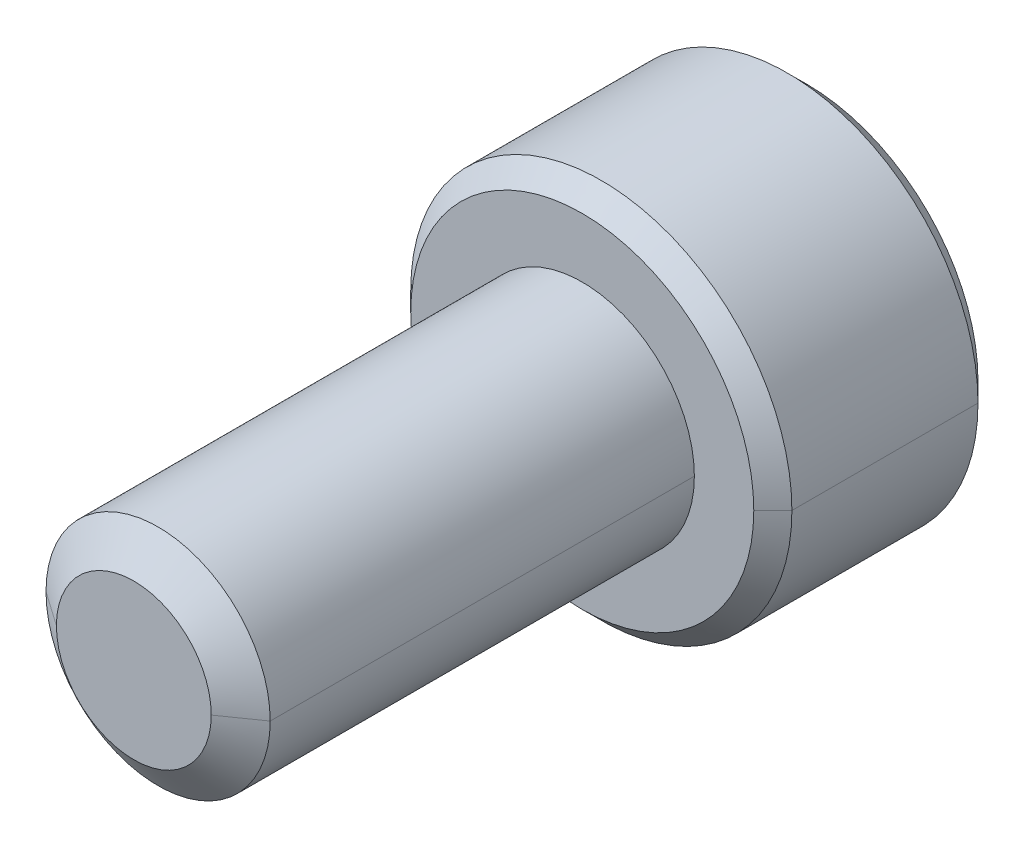
ISO-10303-21;
HEADER;
FILE_DESCRIPTION(('STEP AP214'),'2;1');
FILE_NAME('part.step','',(''),(''),'','','');
FILE_SCHEMA(('AUTOMOTIVE_DESIGN { 1 0 10303 214 1 1 1 1 }'));
ENDSEC;
DATA;
#1=APPLICATION_CONTEXT('core data for automotive mechanical design processes');
#2=APPLICATION_PROTOCOL_DEFINITION('international standard','automotive_design',2000,#1);
#3=PRODUCT_CONTEXT('',#1,'mechanical');
#4=PRODUCT('Part','Part','',(#3));
#5=PRODUCT_RELATED_PRODUCT_CATEGORY('part','',(#4));
#6=PRODUCT_DEFINITION_FORMATION('','',#4);
#7=PRODUCT_DEFINITION_CONTEXT('part definition',#1,'design');
#8=PRODUCT_DEFINITION('design','',#6,#7);
#9=PRODUCT_DEFINITION_SHAPE('','',#8);
#10=(LENGTH_UNIT() NAMED_UNIT(*) SI_UNIT(.MILLI.,.METRE.));
#11=(NAMED_UNIT(*) PLANE_ANGLE_UNIT() SI_UNIT($,.RADIAN.));
#12=(NAMED_UNIT(*) SI_UNIT($,.STERADIAN.) SOLID_ANGLE_UNIT());
#13=UNCERTAINTY_MEASURE_WITH_UNIT(LENGTH_MEASURE(1.E-05),#10,'distance_accuracy_value','');
#14=(GEOMETRIC_REPRESENTATION_CONTEXT(3) GLOBAL_UNCERTAINTY_ASSIGNED_CONTEXT((#13)) GLOBAL_UNIT_ASSIGNED_CONTEXT((#10,
#11,#12)) REPRESENTATION_CONTEXT('',''));
#15=CARTESIAN_POINT('',(0.,0.,0.));
#16=DIRECTION('',(0.,0.,1.));
#17=DIRECTION('',(1.,0.,0.));
#18=AXIS2_PLACEMENT_3D('',#15,#16,#17);
#19=CARTESIAN_POINT('',(0.,0.,-10.425));
#20=DIRECTION('',(0.,0.,-1.));
#21=DIRECTION('',(-1.,0.,0.));
#22=AXIS2_PLACEMENT_3D('',#19,#20,#21);
#23=CONICAL_SURFACE('',#22,4.25,0.785398163397452);
#24=CARTESIAN_POINT('',(0.,0.,-10.));
#25=DIRECTION('',(0.,0.,1.));
#26=DIRECTION('',(-1.,0.,0.));
#27=AXIS2_PLACEMENT_3D('',#24,#25,#26);
#28=CIRCLE('',#27,3.825);
#29=CARTESIAN_POINT('',(3.825,0.,-10.));
#30=VERTEX_POINT('',#29);
#31=CARTESIAN_POINT('',(-3.825,0.,-10.));
#32=VERTEX_POINT('',#31);
#33=EDGE_CURVE('E44',#30,#32,#28,.T.);
#34=ORIENTED_EDGE('',*,*,#33,.F.);
#35=DIRECTION('',(0.707106781186551,0.,-0.707106781186545));
#36=VECTOR('',#35,1.);
#37=CARTESIAN_POINT('',(4.25,0.,-10.425));
#38=LINE('',#37,#36);
#39=CARTESIAN_POINT('',(4.25,0.,-10.425));
#40=VERTEX_POINT('',#39);
#41=EDGE_CURVE('E11',#30,#40,#38,.T.);
#42=ORIENTED_EDGE('',*,*,#41,.T.);
#43=CARTESIAN_POINT('',(0.,0.,-10.425));
#44=DIRECTION('',(0.,0.,-1.));
#45=DIRECTION('',(-1.,0.,0.));
#46=AXIS2_PLACEMENT_3D('',#43,#44,#45);
#47=CIRCLE('',#46,4.25);
#48=CARTESIAN_POINT('',(-4.25,0.,-10.425));
#49=VERTEX_POINT('',#48);
#50=EDGE_CURVE('E877',#49,#40,#47,.T.);
#51=ORIENTED_EDGE('',*,*,#50,.F.);
#52=DIRECTION('',(-0.707106781186551,0.,-0.707106781186545));
#53=VECTOR('',#52,1.);
#54=CARTESIAN_POINT('',(-4.25,0.,-10.425));
#55=LINE('',#54,#53);
#56=EDGE_CURVE('E99',#32,#49,#55,.T.);
#57=ORIENTED_EDGE('',*,*,#56,.F.);
#58=EDGE_LOOP('',(#34,#42,#51,#57));
#59=FACE_BOUND('',#58,.T.);
#60=ADVANCED_FACE('F16',(#59),#23,.T.);
#61=CARTESIAN_POINT('',(0.,0.,-15.));
#62=DIRECTION('',(0.,0.,1.));
#63=DIRECTION('',(1.,0.,0.));
#64=AXIS2_PLACEMENT_3D('',#61,#62,#63);
#65=CONICAL_SURFACE('',#64,3.825,0.785398163397442);
#66=CARTESIAN_POINT('',(0.,0.,-15.));
#67=DIRECTION('',(0.,0.,-1.));
#68=DIRECTION('',(-1.,0.,0.));
#69=AXIS2_PLACEMENT_3D('',#66,#67,#68);
#70=CIRCLE('',#69,3.825);
#71=CARTESIAN_POINT('',(-3.825,0.,-15.));
#72=VERTEX_POINT('',#71);
#73=CARTESIAN_POINT('',(3.825,0.,-15.));
#74=VERTEX_POINT('',#73);
#75=EDGE_CURVE('E858',#72,#74,#70,.T.);
#76=ORIENTED_EDGE('',*,*,#75,.F.);
#77=DIRECTION('',(-0.707106781186543,0.,0.707106781186552));
#78=VECTOR('',#77,1.);
#79=CARTESIAN_POINT('',(-3.825,0.,-15.));
#80=LINE('',#79,#78);
#81=CARTESIAN_POINT('',(-4.25,0.,-14.575));
#82=VERTEX_POINT('',#81);
#83=EDGE_CURVE('E30',#72,#82,#80,.T.);
#84=ORIENTED_EDGE('',*,*,#83,.T.);
#85=CARTESIAN_POINT('',(0.,0.,-14.575));
#86=DIRECTION('',(0.,0.,1.));
#87=DIRECTION('',(-1.,0.,0.));
#88=AXIS2_PLACEMENT_3D('',#85,#86,#87);
#89=CIRCLE('',#88,4.25);
#90=CARTESIAN_POINT('',(4.25,0.,-14.575));
#91=VERTEX_POINT('',#90);
#92=EDGE_CURVE('E417',#91,#82,#89,.T.);
#93=ORIENTED_EDGE('',*,*,#92,.F.);
#94=DIRECTION('',(0.707106781186543,0.,0.707106781186552));
#95=VECTOR('',#94,1.);
#96=CARTESIAN_POINT('',(3.825,0.,-15.));
#97=LINE('',#96,#95);
#98=EDGE_CURVE('E407',#74,#91,#97,.T.);
#99=ORIENTED_EDGE('',*,*,#98,.F.);
#100=EDGE_LOOP('',(#76,#84,#93,#99));
#101=FACE_BOUND('',#100,.T.);
#102=ADVANCED_FACE('F262',(#101),#65,.T.);
#103=CARTESIAN_POINT('',(0.,0.,-15.));
#104=DIRECTION('',(0.,0.,-1.));
#105=DIRECTION('',(-1.,0.,0.));
#106=AXIS2_PLACEMENT_3D('',#103,#104,#105);
#107=CONICAL_SURFACE('',#106,2.30940107675851,0.78539816339745);
#108=CARTESIAN_POINT('',(-2.,0.,-14.6905989232415));
#109=CARTESIAN_POINT('',(-2.,0.290764194433292,-14.6905989232415));
#110=CARTESIAN_POINT('',(-2.,0.594613289971653,-14.7771187445255));
#111=CARTESIAN_POINT('',(-2.,0.860171071046533,-14.8527352663336));
#112=CARTESIAN_POINT('',(-2.,1.15470053837925,-15.));
#113=B_SPLINE_CURVE_WITH_KNOTS('',2,(#108,#109,#110,#111,#112),.UNSPECIFIED.,.F.,.F.,(3,2,3),
(0.,0.5,1.),.UNSPECIFIED.);
#114=CARTESIAN_POINT('',(-2.,0.,-14.6905989232415));
#115=VERTEX_POINT('',#114);
#116=CARTESIAN_POINT('',(-2.,1.15470053837925,-15.));
#117=VERTEX_POINT('',#116);
#118=EDGE_CURVE('E174',#115,#117,#113,.T.);
#119=ORIENTED_EDGE('',*,*,#118,.F.);
#120=DIRECTION('',(-0.707106781186549,0.,-0.707106781186546));
#121=VECTOR('',#120,1.);
#122=CARTESIAN_POINT('',(-2.30940107675851,0.,-15.));
#123=LINE('',#122,#121);
#124=CARTESIAN_POINT('',(-2.30940107675851,0.,-15.));
#125=VERTEX_POINT('',#124);
#126=EDGE_CURVE('E167',#115,#125,#123,.T.);
#127=ORIENTED_EDGE('',*,*,#126,.T.);
#128=CARTESIAN_POINT('',(0.,0.,-15.));
#129=DIRECTION('',(0.,0.,-1.));
#130=DIRECTION('',(-1.,0.,0.));
#131=AXIS2_PLACEMENT_3D('',#128,#129,#130);
#132=CIRCLE('',#131,2.30940107675851);
#133=EDGE_CURVE('E194',#125,#117,#132,.T.);
#134=ORIENTED_EDGE('',*,*,#133,.T.);
#135=EDGE_LOOP('',(#119,#127,#134));
#136=FACE_BOUND('',#135,.T.);
#137=ADVANCED_FACE('F253',(#136),#107,.F.);
#138=CARTESIAN_POINT('',(0.,0.,-15.));
#139=DIRECTION('',(0.,0.,1.));
#140=DIRECTION('',(1.,0.,0.));
#141=AXIS2_PLACEMENT_3D('',#138,#139,#140);
#142=CYLINDRICAL_SURFACE('',#141,4.25);
#143=ORIENTED_EDGE('',*,*,#92,.T.);
#144=DIRECTION('',(0.,0.,1.));
#145=VECTOR('',#144,1.);
#146=CARTESIAN_POINT('',(-4.25,0.,-15.));
#147=LINE('',#146,#145);
#148=EDGE_CURVE('E873',#82,#49,#147,.T.);
#149=ORIENTED_EDGE('',*,*,#148,.T.);
#150=ORIENTED_EDGE('',*,*,#50,.T.);
#151=DIRECTION('',(0.,0.,1.));
#152=VECTOR('',#151,1.);
#153=CARTESIAN_POINT('',(4.25,0.,-15.));
#154=LINE('',#153,#152);
#155=EDGE_CURVE('E850',#91,#40,#154,.T.);
#156=ORIENTED_EDGE('',*,*,#155,.F.);
#157=EDGE_LOOP('',(#143,#149,#150,#156));
#158=FACE_BOUND('',#157,.T.);
#159=ADVANCED_FACE('F261',(#158),#142,.T.);
#160=CARTESIAN_POINT('',(0.,0.,0.));
#161=DIRECTION('',(0.,0.,-1.));
#162=DIRECTION('',(-1.,0.,0.));
#163=AXIS2_PLACEMENT_3D('',#160,#161,#162);
#164=CONICAL_SURFACE('',#163,1.72638475772934,0.959931088596884);
#165=CARTESIAN_POINT('',(0.,0.,0.));
#166=DIRECTION('',(0.,0.,1.));
#167=DIRECTION('',(1.,0.,0.));
#168=AXIS2_PLACEMENT_3D('',#165,#166,#167);
#169=CIRCLE('',#168,1.72638475772934);
#170=CARTESIAN_POINT('',(1.72638475772934,0.,0.));
#171=VERTEX_POINT('',#170);
#172=CARTESIAN_POINT('',(-1.72638475772934,0.,0.));
#173=VERTEX_POINT('',#172);
#174=EDGE_CURVE('E842',#171,#173,#169,.T.);
#175=ORIENTED_EDGE('',*,*,#174,.F.);
#176=DIRECTION('',(0.819152044288993,0.,-0.573576436351044));
#177=VECTOR('',#176,1.);
#178=CARTESIAN_POINT('',(1.72638475772934,0.,0.));
#179=LINE('',#178,#177);
#180=CARTESIAN_POINT('',(2.5,0.,-0.541691224311848));
#181=VERTEX_POINT('',#180);
#182=EDGE_CURVE('E891',#171,#181,#179,.T.);
#183=ORIENTED_EDGE('',*,*,#182,.T.);
#184=CARTESIAN_POINT('',(0.,0.,-0.541691224311848));
#185=DIRECTION('',(0.,0.,1.));
#186=DIRECTION('',(1.,0.,0.));
#187=AXIS2_PLACEMENT_3D('',#184,#185,#186);
#188=CIRCLE('',#187,2.5);
#189=CARTESIAN_POINT('',(-2.5,0.,-0.541691224311848));
#190=VERTEX_POINT('',#189);
#191=EDGE_CURVE('E894',#181,#190,#188,.T.);
#192=ORIENTED_EDGE('',*,*,#191,.T.);
#193=DIRECTION('',(-0.819152044288993,0.,-0.573576436351044));
#194=VECTOR('',#193,1.);
#195=CARTESIAN_POINT('',(-1.72638475772934,0.,0.));
#196=LINE('',#195,#194);
#197=EDGE_CURVE('E864',#173,#190,#196,.T.);
#198=ORIENTED_EDGE('',*,*,#197,.F.);
#199=EDGE_LOOP('',(#175,#183,#192,#198));
#200=FACE_BOUND('',#199,.T.);
#201=ADVANCED_FACE('F229',(#200),#164,.T.);
#202=CARTESIAN_POINT('',(0.,0.,-10.));
#203=DIRECTION('',(0.,0.,1.));
#204=DIRECTION('',(1.,0.,0.));
#205=AXIS2_PLACEMENT_3D('',#202,#203,#204);
#206=CYLINDRICAL_SURFACE('',#205,2.5);
#207=CARTESIAN_POINT('',(0.,0.,-10.));
#208=DIRECTION('',(0.,0.,1.));
#209=DIRECTION('',(-1.,0.,0.));
#210=AXIS2_PLACEMENT_3D('',#207,#208,#209);
#211=CIRCLE('',#210,2.5);
#212=CARTESIAN_POINT('',(2.5,0.,-10.));
#213=VERTEX_POINT('',#212);
#214=CARTESIAN_POINT('',(-2.5,0.,-10.));
#215=VERTEX_POINT('',#214);
#216=EDGE_CURVE('E846',#213,#215,#211,.T.);
#217=ORIENTED_EDGE('',*,*,#216,.T.);
#218=DIRECTION('',(0.,0.,1.));
#219=VECTOR('',#218,1.);
#220=CARTESIAN_POINT('',(-2.5,0.,-10.));
#221=LINE('',#220,#219);
#222=EDGE_CURVE('E843',#215,#190,#221,.T.);
#223=ORIENTED_EDGE('',*,*,#222,.T.);
#224=ORIENTED_EDGE('',*,*,#191,.F.);
#225=DIRECTION('',(0.,0.,1.));
#226=VECTOR('',#225,1.);
#227=CARTESIAN_POINT('',(2.5,0.,-10.));
#228=LINE('',#227,#226);
#229=EDGE_CURVE('E866',#213,#181,#228,.T.);
#230=ORIENTED_EDGE('',*,*,#229,.F.);
#231=EDGE_LOOP('',(#217,#223,#224,#230));
#232=FACE_BOUND('',#231,.T.);
#233=ADVANCED_FACE('F290',(#232),#206,.T.);
#234=CARTESIAN_POINT('',(0.,0.,-10.));
#235=DIRECTION('',(0.,0.,1.));
#236=DIRECTION('',(1.,0.,0.));
#237=AXIS2_PLACEMENT_3D('',#234,#235,#236);
#238=CYLINDRICAL_SURFACE('',#237,2.5);
#239=ORIENTED_EDGE('',*,*,#222,.F.);
#240=CARTESIAN_POINT('',(0.,0.,-10.));
#241=DIRECTION('',(0.,0.,1.));
#242=DIRECTION('',(-1.,0.,0.));
#243=AXIS2_PLACEMENT_3D('',#240,#241,#242);
#244=CIRCLE('',#243,2.5);
#245=EDGE_CURVE('E847',#215,#213,#244,.T.);
#246=ORIENTED_EDGE('',*,*,#245,.T.);
#247=ORIENTED_EDGE('',*,*,#229,.T.);
#248=CARTESIAN_POINT('',(0.,0.,-0.541691224311848));
#249=DIRECTION('',(0.,0.,1.));
#250=DIRECTION('',(1.,0.,0.));
#251=AXIS2_PLACEMENT_3D('',#248,#249,#250);
#252=CIRCLE('',#251,2.5);
#253=EDGE_CURVE('E841',#190,#181,#252,.T.);
#254=ORIENTED_EDGE('',*,*,#253,.F.);
#255=EDGE_LOOP('',(#239,#246,#247,#254));
#256=FACE_BOUND('',#255,.T.);
#257=ADVANCED_FACE('F293',(#256),#238,.T.);
#258=CARTESIAN_POINT('',(0.,0.,0.));
#259=DIRECTION('',(0.,0.,-1.));
#260=DIRECTION('',(-1.,0.,0.));
#261=AXIS2_PLACEMENT_3D('',#258,#259,#260);
#262=CONICAL_SURFACE('',#261,1.72638475772934,0.959931088596884);
#263=ORIENTED_EDGE('',*,*,#182,.F.);
#264=CARTESIAN_POINT('',(0.,0.,0.));
#265=DIRECTION('',(0.,0.,1.));
#266=DIRECTION('',(1.,0.,0.));
#267=AXIS2_PLACEMENT_3D('',#264,#265,#266);
#268=CIRCLE('',#267,1.72638475772934);
#269=EDGE_CURVE('E838',#173,#171,#268,.T.);
#270=ORIENTED_EDGE('',*,*,#269,.F.);
#271=ORIENTED_EDGE('',*,*,#197,.T.);
#272=ORIENTED_EDGE('',*,*,#253,.T.);
#273=EDGE_LOOP('',(#263,#270,#271,#272));
#274=FACE_BOUND('',#273,.T.);
#275=ADVANCED_FACE('F495',(#274),#262,.T.);
#276=CARTESIAN_POINT('',(0.,0.,0.));
#277=DIRECTION('',(0.,0.,1.));
#278=DIRECTION('',(1.,0.,0.));
#279=AXIS2_PLACEMENT_3D('',#276,#277,#278);
#280=PLANE('',#279);
#281=ORIENTED_EDGE('',*,*,#269,.T.);
#282=ORIENTED_EDGE('',*,*,#174,.T.);
#283=EDGE_LOOP('',(#281,#282));
#284=FACE_BOUND('',#283,.T.);
#285=ADVANCED_FACE('F276',(#284),#280,.T.);
#286=CARTESIAN_POINT('',(0.,0.,-15.));
#287=DIRECTION('',(0.,0.,1.));
#288=DIRECTION('',(1.,0.,0.));
#289=AXIS2_PLACEMENT_3D('',#286,#287,#288);
#290=CYLINDRICAL_SURFACE('',#289,4.25);
#291=ORIENTED_EDGE('',*,*,#148,.F.);
#292=CARTESIAN_POINT('',(0.,0.,-14.575));
#293=DIRECTION('',(0.,0.,1.));
#294=DIRECTION('',(-1.,0.,0.));
#295=AXIS2_PLACEMENT_3D('',#292,#293,#294);
#296=CIRCLE('',#295,4.25);
#297=EDGE_CURVE('E855',#82,#91,#296,.T.);
#298=ORIENTED_EDGE('',*,*,#297,.T.);
#299=ORIENTED_EDGE('',*,*,#155,.T.);
#300=CARTESIAN_POINT('',(0.,0.,-10.425));
#301=DIRECTION('',(0.,0.,-1.));
#302=DIRECTION('',(-1.,0.,0.));
#303=AXIS2_PLACEMENT_3D('',#300,#301,#302);
#304=CIRCLE('',#303,4.25);
#305=EDGE_CURVE('E848',#40,#49,#304,.T.);
#306=ORIENTED_EDGE('',*,*,#305,.T.);
#307=EDGE_LOOP('',(#291,#298,#299,#306));
#308=FACE_BOUND('',#307,.T.);
#309=ADVANCED_FACE('F267',(#308),#290,.T.);
#310=CARTESIAN_POINT('',(0.,0.,-15.));
#311=DIRECTION('',(0.,0.,-1.));
#312=DIRECTION('',(0.,-1.,0.));
#313=AXIS2_PLACEMENT_3D('',#310,#311,#312);
#314=PLANE('',#313);
#315=CARTESIAN_POINT('',(0.,0.,-15.));
#316=DIRECTION('',(0.,0.,-1.));
#317=DIRECTION('',(-1.,0.,0.));
#318=AXIS2_PLACEMENT_3D('',#315,#316,#317);
#319=CIRCLE('',#318,3.825);
#320=EDGE_CURVE('E851',#74,#72,#319,.T.);
#321=ORIENTED_EDGE('',*,*,#320,.T.);
#322=ORIENTED_EDGE('',*,*,#75,.T.);
#323=EDGE_LOOP('',(#321,#322));
#324=FACE_BOUND('',#323,.T.);
#325=CARTESIAN_POINT('',(0.,0.,-15.));
#326=DIRECTION('',(0.,0.,-1.));
#327=DIRECTION('',(-1.,0.,0.));
#328=AXIS2_PLACEMENT_3D('',#325,#326,#327);
#329=CIRCLE('',#328,2.30940107675851);
#330=CARTESIAN_POINT('',(0.,2.30940107675851,-15.));
#331=VERTEX_POINT('',#330);
#332=EDGE_CURVE('E196',#117,#331,#329,.T.);
#333=ORIENTED_EDGE('',*,*,#332,.F.);
#334=ORIENTED_EDGE('',*,*,#133,.F.);
#335=CARTESIAN_POINT('',(0.,0.,-15.));
#336=DIRECTION('',(0.,0.,-1.));
#337=DIRECTION('',(-1.,0.,0.));
#338=AXIS2_PLACEMENT_3D('',#335,#336,#337);
#339=CIRCLE('',#338,2.30940107675851);
#340=CARTESIAN_POINT('',(-2.,-1.15470053837925,-15.));
#341=VERTEX_POINT('',#340);
#342=EDGE_CURVE('E165',#341,#125,#339,.T.);
#343=ORIENTED_EDGE('',*,*,#342,.F.);
#344=CARTESIAN_POINT('',(0.,0.,-15.));
#345=DIRECTION('',(0.,0.,-1.));
#346=DIRECTION('',(-1.,0.,0.));
#347=AXIS2_PLACEMENT_3D('',#344,#345,#346);
#348=CIRCLE('',#347,2.30940107675851);
#349=CARTESIAN_POINT('',(0.,-2.30940107675851,-15.));
#350=VERTEX_POINT('',#349);
#351=EDGE_CURVE('E191',#350,#341,#348,.T.);
#352=ORIENTED_EDGE('',*,*,#351,.F.);
#353=CARTESIAN_POINT('',(0.,0.,-15.));
#354=DIRECTION('',(0.,0.,-1.));
#355=DIRECTION('',(-1.,0.,0.));
#356=AXIS2_PLACEMENT_3D('',#353,#354,#355);
#357=CIRCLE('',#356,2.30940107675851);
#358=CARTESIAN_POINT('',(2.,-1.15470053837925,-15.));
#359=VERTEX_POINT('',#358);
#360=EDGE_CURVE('E200',#359,#350,#357,.T.);
#361=ORIENTED_EDGE('',*,*,#360,.F.);
#362=CARTESIAN_POINT('',(0.,0.,-15.));
#363=DIRECTION('',(0.,0.,-1.));
#364=DIRECTION('',(-1.,0.,0.));
#365=AXIS2_PLACEMENT_3D('',#362,#363,#364);
#366=CIRCLE('',#365,2.30940107675851);
#367=CARTESIAN_POINT('',(2.,1.15470053837925,-15.));
#368=VERTEX_POINT('',#367);
#369=EDGE_CURVE('E923',#368,#359,#366,.T.);
#370=ORIENTED_EDGE('',*,*,#369,.F.);
#371=CARTESIAN_POINT('',(0.,0.,-15.));
#372=DIRECTION('',(0.,0.,-1.));
#373=DIRECTION('',(-1.,0.,0.));
#374=AXIS2_PLACEMENT_3D('',#371,#372,#373);
#375=CIRCLE('',#374,2.30940107675851);
#376=EDGE_CURVE('E411',#331,#368,#375,.T.);
#377=ORIENTED_EDGE('',*,*,#376,.F.);
#378=EDGE_LOOP('',(#333,#334,#343,#352,#361,#370,#377));
#379=FACE_BOUND('',#378,.T.);
#380=ADVANCED_FACE('F189',(#324,#379),#314,.T.);
#381=CARTESIAN_POINT('',(0.,0.,-10.));
#382=DIRECTION('',(0.,0.,-1.));
#383=DIRECTION('',(0.,-1.,0.));
#384=AXIS2_PLACEMENT_3D('',#381,#382,#383);
#385=PLANE('',#384);
#386=CARTESIAN_POINT('',(0.,0.,-10.));
#387=DIRECTION('',(0.,0.,1.));
#388=DIRECTION('',(-1.,0.,0.));
#389=AXIS2_PLACEMENT_3D('',#386,#387,#388);
#390=CIRCLE('',#389,3.825);
#391=EDGE_CURVE('E863',#32,#30,#390,.T.);
#392=ORIENTED_EDGE('',*,*,#391,.T.);
#393=ORIENTED_EDGE('',*,*,#33,.T.);
#394=EDGE_LOOP('',(#392,#393));
#395=FACE_BOUND('',#394,.T.);
#396=ORIENTED_EDGE('',*,*,#216,.F.);
#397=ORIENTED_EDGE('',*,*,#245,.F.);
#398=EDGE_LOOP('',(#396,#397));
#399=FACE_BOUND('',#398,.T.);
#400=ADVANCED_FACE('F266',(#395,#399),#385,.F.);
#401=CARTESIAN_POINT('',(0.,0.,-15.));
#402=DIRECTION('',(0.,0.,-1.));
#403=DIRECTION('',(-1.,0.,0.));
#404=AXIS2_PLACEMENT_3D('',#401,#402,#403);
#405=CONICAL_SURFACE('',#404,2.30940107675851,0.78539816339745);
#406=ORIENTED_EDGE('',*,*,#376,.T.);
#407=CARTESIAN_POINT('',(0.,2.30940107675851,-15.));
#408=CARTESIAN_POINT('',(0.252681558768904,2.16351531078402,-14.8541142340255));
#409=CARTESIAN_POINT('',(0.481557611863588,2.03137365991875,-14.7782714741353));
#410=CARTESIAN_POINT('',(0.744004310414816,1.87984998786227,-14.6913043944733));
#411=CARTESIAN_POINT('',(0.996316959809437,1.73417721181434,-14.6906034448313));
#412=CARTESIAN_POINT('',(1.24817855175002,1.58876485390891,-14.6899037482718));
#413=CARTESIAN_POINT('',(1.51174853644651,1.43659265229409,-14.7760681956293));
#414=CARTESIAN_POINT('',(1.74318494981327,1.30297277673651,-14.851727761642));
#415=CARTESIAN_POINT('',(2.,1.15470053837926,-15.));
#416=B_SPLINE_CURVE_WITH_KNOTS('',2,(#407,#408,#409,#410,#411,#412,#413,#414,#415),
.UNSPECIFIED.,.F.,.F.,(3,2,2,2,3),(0.,0.25,0.5,0.75,1.),.UNSPECIFIED.);
#417=EDGE_CURVE('E783',#331,#368,#416,.T.);
#418=ORIENTED_EDGE('',*,*,#417,.F.);
#419=EDGE_LOOP('',(#406,#418));
#420=FACE_BOUND('',#419,.T.);
#421=ADVANCED_FACE('F231',(#420),#405,.F.);
#422=CARTESIAN_POINT('',(0.,0.,-15.));
#423=DIRECTION('',(0.,0.,-1.));
#424=DIRECTION('',(-1.,0.,0.));
#425=AXIS2_PLACEMENT_3D('',#422,#423,#424);
#426=CONICAL_SURFACE('',#425,2.30940107675851,0.78539816339745);
#427=ORIENTED_EDGE('',*,*,#369,.T.);
#428=CARTESIAN_POINT('',(2.,1.15470053837925,-15.));
#429=CARTESIAN_POINT('',(2.,0.860776317135769,-14.8530378893783));
#430=CARTESIAN_POINT('',(2.,0.594673185465975,-14.7771358142435));
#431=CARTESIAN_POINT('',(2.,0.291633315756037,-14.6906980680388));
#432=CARTESIAN_POINT('',(2.,0.000125895055206075,-14.6905989272039));
#433=CARTESIAN_POINT('',(2.,-0.29032906321194,-14.6905001443085));
#434=CARTESIAN_POINT('',(2.,-0.594425580363408,-14.7770652590807));
#435=CARTESIAN_POINT('',(2.,-0.860068804160053,-14.8526841328904));
#436=CARTESIAN_POINT('',(2.,-1.15470053837925,-15.));
#437=B_SPLINE_CURVE_WITH_KNOTS('',2,(#428,#429,#430,#431,#432,#433,#434,#435,#436),
.UNSPECIFIED.,.F.,.F.,(3,2,2,2,3),(0.,0.25,0.5,0.75,1.),.UNSPECIFIED.);
#438=EDGE_CURVE('E330',#368,#359,#437,.T.);
#439=ORIENTED_EDGE('',*,*,#438,.F.);
#440=EDGE_LOOP('',(#427,#439));
#441=FACE_BOUND('',#440,.T.);
#442=ADVANCED_FACE('F298',(#441),#426,.F.);
#443=CARTESIAN_POINT('',(0.,0.,-15.));
#444=DIRECTION('',(0.,0.,-1.));
#445=DIRECTION('',(-1.,0.,0.));
#446=AXIS2_PLACEMENT_3D('',#443,#444,#445);
#447=CONICAL_SURFACE('',#446,2.30940107675851,0.78539816339745);
#448=ORIENTED_EDGE('',*,*,#360,.T.);
#449=CARTESIAN_POINT('',(2.,-1.15470053837925,-15.));
#450=CARTESIAN_POINT('',(1.74731844122936,-1.30058630435474,-14.8541142340245));
#451=CARTESIAN_POINT('',(1.51844238813641,-1.43272795521901,-14.7782714741353));
#452=CARTESIAN_POINT('',(1.25599568958083,-1.584251627278,-14.6913043944724));
#453=CARTESIAN_POINT('',(1.00368304019056,-1.72992440332342,-14.6906034448313));
#454=CARTESIAN_POINT('',(0.751821448245721,-1.8753367612313,-14.6899037482728));
#455=CARTESIAN_POINT('',(0.488251463553495,-2.02750896284366,-14.7760681956293));
#456=CARTESIAN_POINT('',(0.256815050185085,-2.1611288384022,-14.851727761643));
#457=CARTESIAN_POINT('',(0.,-2.3094010767585,-15.));
#458=B_SPLINE_CURVE_WITH_KNOTS('',2,(#449,#450,#451,#452,#453,#454,#455,#456,#457),
.UNSPECIFIED.,.F.,.F.,(3,2,2,2,3),(0.,0.25,0.5,0.75,1.),.UNSPECIFIED.);
#459=EDGE_CURVE('E314',#359,#350,#458,.T.);
#460=ORIENTED_EDGE('',*,*,#459,.F.);
#461=EDGE_LOOP('',(#448,#460));
#462=FACE_BOUND('',#461,.T.);
#463=ADVANCED_FACE('F295',(#462),#447,.F.);
#464=CARTESIAN_POINT('',(0.,0.,-15.));
#465=DIRECTION('',(0.,0.,-1.));
#466=DIRECTION('',(-1.,0.,0.));
#467=AXIS2_PLACEMENT_3D('',#464,#465,#466);
#468=CONICAL_SURFACE('',#467,2.30940107675851,0.78539816339745);
#469=ORIENTED_EDGE('',*,*,#351,.T.);
#470=CARTESIAN_POINT('',(0.,-2.30940107675851,-15.));
#471=CARTESIAN_POINT('',(-0.252681558772496,-2.16351531078195,-14.8541142340234));
#472=CARTESIAN_POINT('',(-0.481557611863587,-2.03137365991875,-14.7782714741353));
#473=CARTESIAN_POINT('',(-0.744004310415086,-1.87984998786211,-14.6913043944743));
#474=CARTESIAN_POINT('',(-0.996316959809437,-1.73417721181434,-14.6906034448313));
#475=CARTESIAN_POINT('',(-1.24817855174854,-1.58876485390977,-14.6899037482709));
#476=CARTESIAN_POINT('',(-1.51174853644651,-1.43659265229409,-14.7760681956293));
#477=CARTESIAN_POINT('',(-1.74318494981483,-1.30297277673561,-14.8517277616429));
#478=CARTESIAN_POINT('',(-2.,-1.15470053837925,-15.));
#479=B_SPLINE_CURVE_WITH_KNOTS('',2,(#470,#471,#472,#473,#474,#475,#476,#477,#478),
.UNSPECIFIED.,.F.,.F.,(3,2,2,2,3),(0.,0.25,0.5,0.75,1.),.UNSPECIFIED.);
#480=EDGE_CURVE('E150',#350,#341,#479,.T.);
#481=ORIENTED_EDGE('',*,*,#480,.F.);
#482=EDGE_LOOP('',(#469,#481));
#483=FACE_BOUND('',#482,.T.);
#484=ADVANCED_FACE('F198',(#483),#468,.F.);
#485=CARTESIAN_POINT('',(0.,0.,-15.));
#486=DIRECTION('',(0.,0.,-1.));
#487=DIRECTION('',(-1.,0.,0.));
#488=AXIS2_PLACEMENT_3D('',#485,#486,#487);
#489=CONICAL_SURFACE('',#488,2.30940107675851,0.78539816339745);
#490=ORIENTED_EDGE('',*,*,#126,.F.);
#491=CARTESIAN_POINT('',(-2.,-1.15470053837925,-15.));
#492=CARTESIAN_POINT('',(-2.,-0.860674554250854,-14.8529870079358));
#493=CARTESIAN_POINT('',(-2.,-0.594485324553538,-14.7770822807379));
#494=CARTESIAN_POINT('',(-2.,-0.291198043728589,-14.6905989232415));
#495=CARTESIAN_POINT('',(-2.,0.,-14.6905989232415));
#496=B_SPLINE_CURVE_WITH_KNOTS('',2,(#491,#492,#493,#494,#495),.UNSPECIFIED.,.F.,.F.,(3,2,3),
(0.,0.5,1.),.UNSPECIFIED.);
#497=EDGE_CURVE('E161',#341,#115,#496,.T.);
#498=ORIENTED_EDGE('',*,*,#497,.F.);
#499=ORIENTED_EDGE('',*,*,#342,.T.);
#500=EDGE_LOOP('',(#490,#498,#499));
#501=FACE_BOUND('',#500,.T.);
#502=ADVANCED_FACE('F163',(#501),#489,.F.);
#503=CARTESIAN_POINT('',(0.,0.,-15.));
#504=DIRECTION('',(0.,0.,-1.));
#505=DIRECTION('',(-1.,0.,0.));
#506=AXIS2_PLACEMENT_3D('',#503,#504,#505);
#507=CONICAL_SURFACE('',#506,2.30940107675851,0.78539816339745);
#508=ORIENTED_EDGE('',*,*,#332,.T.);
#509=CARTESIAN_POINT('',(-2.,1.15470053837925,-15.));
#510=CARTESIAN_POINT('',(-1.74731844123292,1.30058630435268,-14.8541142340266));
#511=CARTESIAN_POINT('',(-1.51844238813641,1.43272795521901,-14.7782714741353));
#512=CARTESIAN_POINT('',(-1.25599568958393,1.58425162727621,-14.6913043944724));
#513=CARTESIAN_POINT('',(-1.00368304019056,1.72992440332342,-14.6906034448314));
#514=CARTESIAN_POINT('',(-0.75182144824733,1.87533676123037,-14.6899037482728));
#515=CARTESIAN_POINT('',(-0.488251463553495,2.02750896284366,-14.7760681956293));
#516=CARTESIAN_POINT('',(-0.25681505018699,2.1611288384011,-14.8517277616419));
#517=CARTESIAN_POINT('',(0.,2.3094010767585,-15.));
#518=B_SPLINE_CURVE_WITH_KNOTS('',2,(#509,#510,#511,#512,#513,#514,#515,#516,#517),
.UNSPECIFIED.,.F.,.F.,(3,2,2,2,3),(0.,0.25,0.5,0.75,1.),.UNSPECIFIED.);
#519=EDGE_CURVE('E400',#117,#331,#518,.T.);
#520=ORIENTED_EDGE('',*,*,#519,.F.);
#521=EDGE_LOOP('',(#508,#520));
#522=FACE_BOUND('',#521,.T.);
#523=ADVANCED_FACE('F263',(#522),#507,.F.);
#524=CARTESIAN_POINT('',(2.,3.46410161513775,-12.));
#525=DIRECTION('',(0.,0.,-1.));
#526=DIRECTION('',(0.,-1.,0.));
#527=AXIS2_PLACEMENT_3D('',#524,#525,#526);
#528=PLANE('',#527);
#529=DIRECTION('',(0.866025403784439,0.5,0.));
#530=VECTOR('',#529,1.);
#531=CARTESIAN_POINT('',(-2.,1.15470053837925,-12.));
#532=LINE('',#531,#530);
#533=CARTESIAN_POINT('',(-2.,1.15470053837925,-12.));
#534=VERTEX_POINT('',#533);
#535=CARTESIAN_POINT('',(0.,2.30940107675851,-12.));
#536=VERTEX_POINT('',#535);
#537=EDGE_CURVE('E414',#534,#536,#532,.T.);
#538=ORIENTED_EDGE('',*,*,#537,.T.);
#539=DIRECTION('',(0.866025403784439,-0.5,0.));
#540=VECTOR('',#539,1.);
#541=CARTESIAN_POINT('',(0.,2.30940107675851,-12.));
#542=LINE('',#541,#540);
#543=CARTESIAN_POINT('',(2.,1.15470053837925,-12.));
#544=VERTEX_POINT('',#543);
#545=EDGE_CURVE('E437',#536,#544,#542,.T.);
#546=ORIENTED_EDGE('',*,*,#545,.T.);
#547=DIRECTION('',(0.,-1.,0.));
#548=VECTOR('',#547,1.);
#549=CARTESIAN_POINT('',(2.,1.15470053837925,-12.));
#550=LINE('',#549,#548);
#551=CARTESIAN_POINT('',(2.,-1.15470053837925,-12.));
#552=VERTEX_POINT('',#551);
#553=EDGE_CURVE('E773',#544,#552,#550,.T.);
#554=ORIENTED_EDGE('',*,*,#553,.T.);
#555=DIRECTION('',(-0.866025403784439,-0.5,0.));
#556=VECTOR('',#555,1.);
#557=CARTESIAN_POINT('',(2.,-1.15470053837925,-12.));
#558=LINE('',#557,#556);
#559=CARTESIAN_POINT('',(0.,-2.30940107675851,-12.));
#560=VERTEX_POINT('',#559);
#561=EDGE_CURVE('E778',#552,#560,#558,.T.);
#562=ORIENTED_EDGE('',*,*,#561,.T.);
#563=DIRECTION('',(-0.866025403784439,0.5,0.));
#564=VECTOR('',#563,1.);
#565=CARTESIAN_POINT('',(0.,-2.30940107675851,-12.));
#566=LINE('',#565,#564);
#567=CARTESIAN_POINT('',(-2.,-1.15470053837925,-12.));
#568=VERTEX_POINT('',#567);
#569=EDGE_CURVE('E859',#560,#568,#566,.T.);
#570=ORIENTED_EDGE('',*,*,#569,.T.);
#571=DIRECTION('',(0.,1.,0.));
#572=VECTOR('',#571,1.);
#573=CARTESIAN_POINT('',(-2.,-1.15470053837925,-12.));
#574=LINE('',#573,#572);
#575=EDGE_CURVE('E204',#568,#534,#574,.T.);
#576=ORIENTED_EDGE('',*,*,#575,.T.);
#577=EDGE_LOOP('',(#538,#546,#554,#562,#570,#576));
#578=FACE_BOUND('',#577,.T.);
#579=ADVANCED_FACE('F457',(#578),#528,.T.);
#580=CARTESIAN_POINT('',(0.,2.30940107675851,-12.));
#581=DIRECTION('',(0.5,0.866025403784439,0.));
#582=DIRECTION('',(0.,0.,-1.));
#583=AXIS2_PLACEMENT_3D('',#580,#581,#582);
#584=PLANE('',#583);
#585=DIRECTION('',(0.,0.,-1.));
#586=VECTOR('',#585,1.);
#587=CARTESIAN_POINT('',(0.,2.30940107675851,-12.));
#588=LINE('',#587,#586);
#589=EDGE_CURVE('E787',#536,#331,#588,.T.);
#590=ORIENTED_EDGE('',*,*,#589,.T.);
#591=ORIENTED_EDGE('',*,*,#417,.T.);
#592=DIRECTION('',(0.,0.,-1.));
#593=VECTOR('',#592,1.);
#594=CARTESIAN_POINT('',(2.,1.15470053837925,-12.));
#595=LINE('',#594,#593);
#596=EDGE_CURVE('E339',#544,#368,#595,.T.);
#597=ORIENTED_EDGE('',*,*,#596,.F.);
#598=ORIENTED_EDGE('',*,*,#545,.F.);
#599=EDGE_LOOP('',(#590,#591,#597,#598));
#600=FACE_BOUND('',#599,.T.);
#601=ADVANCED_FACE('F453',(#600),#584,.F.);
#602=CARTESIAN_POINT('',(2.,1.15470053837925,-12.));
#603=DIRECTION('',(1.,0.,0.));
#604=DIRECTION('',(0.,1.,0.));
#605=AXIS2_PLACEMENT_3D('',#602,#603,#604);
#606=PLANE('',#605);
#607=ORIENTED_EDGE('',*,*,#596,.T.);
#608=ORIENTED_EDGE('',*,*,#438,.T.);
#609=DIRECTION('',(0.,0.,-1.));
#610=VECTOR('',#609,1.);
#611=CARTESIAN_POINT('',(2.,-1.15470053837925,-12.));
#612=LINE('',#611,#610);
#613=EDGE_CURVE('E321',#552,#359,#612,.T.);
#614=ORIENTED_EDGE('',*,*,#613,.F.);
#615=ORIENTED_EDGE('',*,*,#553,.F.);
#616=EDGE_LOOP('',(#607,#608,#614,#615));
#617=FACE_BOUND('',#616,.T.);
#618=ADVANCED_FACE('F358',(#617),#606,.F.);
#619=CARTESIAN_POINT('',(2.,-1.15470053837925,-12.));
#620=DIRECTION('',(0.5,-0.866025403784439,0.));
#621=DIRECTION('',(0.,0.,-1.));
#622=AXIS2_PLACEMENT_3D('',#619,#620,#621);
#623=PLANE('',#622);
#624=ORIENTED_EDGE('',*,*,#613,.T.);
#625=ORIENTED_EDGE('',*,*,#459,.T.);
#626=DIRECTION('',(0.,0.,-1.));
#627=VECTOR('',#626,1.);
#628=CARTESIAN_POINT('',(0.,-2.30940107675851,-12.));
#629=LINE('',#628,#627);
#630=EDGE_CURVE('E182',#560,#350,#629,.T.);
#631=ORIENTED_EDGE('',*,*,#630,.F.);
#632=ORIENTED_EDGE('',*,*,#561,.F.);
#633=EDGE_LOOP('',(#624,#625,#631,#632));
#634=FACE_BOUND('',#633,.T.);
#635=ADVANCED_FACE('F348',(#634),#623,.F.);
#636=CARTESIAN_POINT('',(0.,-2.30940107675851,-12.));
#637=DIRECTION('',(-0.5,-0.866025403784439,0.));
#638=DIRECTION('',(-0.866025403784439,0.5,0.));
#639=AXIS2_PLACEMENT_3D('',#636,#637,#638);
#640=PLANE('',#639);
#641=ORIENTED_EDGE('',*,*,#630,.T.);
#642=ORIENTED_EDGE('',*,*,#480,.T.);
#643=DIRECTION('',(0.,0.,-1.));
#644=VECTOR('',#643,1.);
#645=CARTESIAN_POINT('',(-2.,-1.15470053837925,-12.));
#646=LINE('',#645,#644);
#647=EDGE_CURVE('E173',#568,#341,#646,.T.);
#648=ORIENTED_EDGE('',*,*,#647,.F.);
#649=ORIENTED_EDGE('',*,*,#569,.F.);
#650=EDGE_LOOP('',(#641,#642,#648,#649));
#651=FACE_BOUND('',#650,.T.);
#652=ADVANCED_FACE('F18',(#651),#640,.F.);
#653=CARTESIAN_POINT('',(-2.,-1.15470053837925,-12.));
#654=DIRECTION('',(-1.,0.,0.));
#655=DIRECTION('',(0.,0.,1.));
#656=AXIS2_PLACEMENT_3D('',#653,#654,#655);
#657=PLANE('',#656);
#658=ORIENTED_EDGE('',*,*,#647,.T.);
#659=ORIENTED_EDGE('',*,*,#497,.T.);
#660=ORIENTED_EDGE('',*,*,#118,.T.);
#661=DIRECTION('',(0.,0.,-1.));
#662=VECTOR('',#661,1.);
#663=CARTESIAN_POINT('',(-2.,1.15470053837925,-12.));
#664=LINE('',#663,#662);
#665=EDGE_CURVE('E406',#534,#117,#664,.T.);
#666=ORIENTED_EDGE('',*,*,#665,.F.);
#667=ORIENTED_EDGE('',*,*,#575,.F.);
#668=EDGE_LOOP('',(#658,#659,#660,#666,#667));
#669=FACE_BOUND('',#668,.T.);
#670=ADVANCED_FACE('F202',(#669),#657,.F.);
#671=CARTESIAN_POINT('',(-2.,1.15470053837925,-12.));
#672=DIRECTION('',(-0.5,0.866025403784439,0.));
#673=DIRECTION('',(0.,0.,1.));
#674=AXIS2_PLACEMENT_3D('',#671,#672,#673);
#675=PLANE('',#674);
#676=ORIENTED_EDGE('',*,*,#665,.T.);
#677=ORIENTED_EDGE('',*,*,#519,.T.);
#678=ORIENTED_EDGE('',*,*,#589,.F.);
#679=ORIENTED_EDGE('',*,*,#537,.F.);
#680=EDGE_LOOP('',(#676,#677,#678,#679));
#681=FACE_BOUND('',#680,.T.);
#682=ADVANCED_FACE('F228',(#681),#675,.F.);
#683=CARTESIAN_POINT('',(0.,0.,-15.));
#684=DIRECTION('',(0.,0.,1.));
#685=DIRECTION('',(1.,0.,0.));
#686=AXIS2_PLACEMENT_3D('',#683,#684,#685);
#687=CONICAL_SURFACE('',#686,3.825,0.785398163397442);
#688=ORIENTED_EDGE('',*,*,#83,.F.);
#689=ORIENTED_EDGE('',*,*,#320,.F.);
#690=ORIENTED_EDGE('',*,*,#98,.T.);
#691=ORIENTED_EDGE('',*,*,#297,.F.);
#692=EDGE_LOOP('',(#688,#689,#690,#691));
#693=FACE_BOUND('',#692,.T.);
#694=ADVANCED_FACE('F360',(#693),#687,.T.);
#695=CARTESIAN_POINT('',(0.,0.,-10.425));
#696=DIRECTION('',(0.,0.,-1.));
#697=DIRECTION('',(-1.,0.,0.));
#698=AXIS2_PLACEMENT_3D('',#695,#696,#697);
#699=CONICAL_SURFACE('',#698,4.25,0.785398163397452);
#700=ORIENTED_EDGE('',*,*,#41,.F.);
#701=ORIENTED_EDGE('',*,*,#391,.F.);
#702=ORIENTED_EDGE('',*,*,#56,.T.);
#703=ORIENTED_EDGE('',*,*,#305,.F.);
#704=EDGE_LOOP('',(#700,#701,#702,#703));
#705=FACE_BOUND('',#704,.T.);
#706=ADVANCED_FACE('F363',(#705),#699,.T.);
#707=CLOSED_SHELL('',(#60,#102,#137,#159,#201,#233,#257,#275,#285,#309,#380,#400,#421,#442,#463,
#484,#502,#523,#579,#601,#618,#635,#652,#670,#682,#694,#706));
#708=MANIFOLD_SOLID_BREP('B1',#707);
#709=ADVANCED_BREP_SHAPE_REPRESENTATION('',(#18,#708),#14);
#710=SHAPE_DEFINITION_REPRESENTATION(#9,#709);
ENDSEC;
END-ISO-10303-21;
